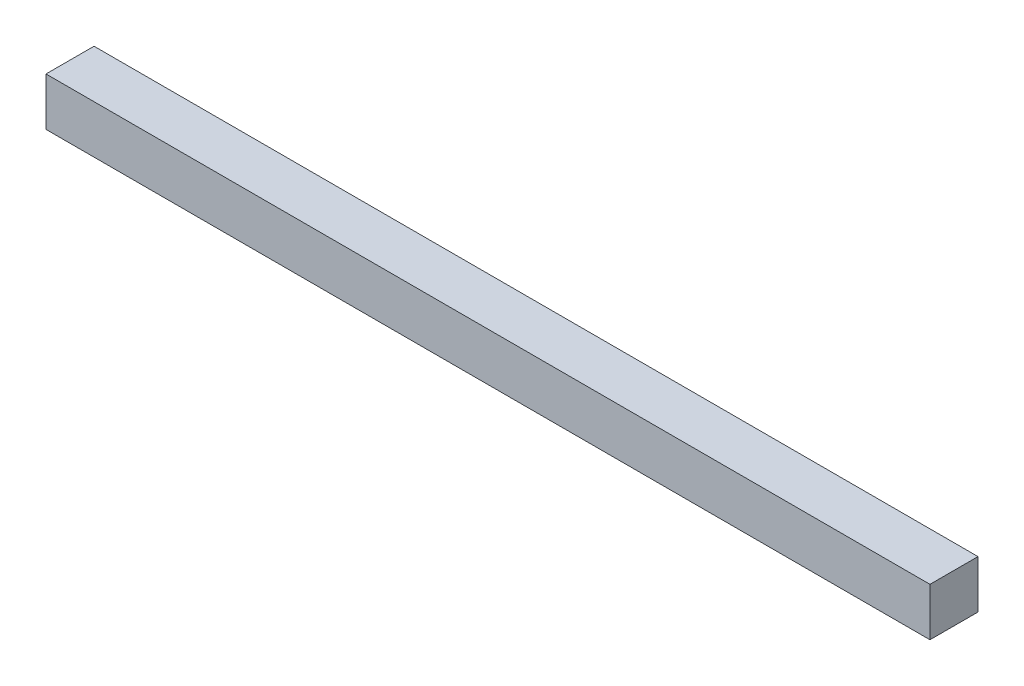
ISO-10303-21;
HEADER;
FILE_DESCRIPTION(('STEP AP214'),'2;1');
FILE_NAME('part.step','',(''),(''),'','','');
FILE_SCHEMA(('AUTOMOTIVE_DESIGN { 1 0 10303 214 1 1 1 1 }'));
ENDSEC;
DATA;
#1=APPLICATION_CONTEXT('core data for automotive mechanical design processes');
#2=APPLICATION_PROTOCOL_DEFINITION('international standard','automotive_design',2000,#1);
#3=PRODUCT_CONTEXT('',#1,'mechanical');
#4=PRODUCT('Part','Part','',(#3));
#5=PRODUCT_RELATED_PRODUCT_CATEGORY('part','',(#4));
#6=PRODUCT_DEFINITION_FORMATION('','',#4);
#7=PRODUCT_DEFINITION_CONTEXT('part definition',#1,'design');
#8=PRODUCT_DEFINITION('design','',#6,#7);
#9=PRODUCT_DEFINITION_SHAPE('','',#8);
#10=(LENGTH_UNIT() NAMED_UNIT(*) SI_UNIT(.MILLI.,.METRE.));
#11=(NAMED_UNIT(*) PLANE_ANGLE_UNIT() SI_UNIT($,.RADIAN.));
#12=(NAMED_UNIT(*) SI_UNIT($,.STERADIAN.) SOLID_ANGLE_UNIT());
#13=UNCERTAINTY_MEASURE_WITH_UNIT(LENGTH_MEASURE(1.E-05),#10,'distance_accuracy_value','');
#14=(GEOMETRIC_REPRESENTATION_CONTEXT(3) GLOBAL_UNCERTAINTY_ASSIGNED_CONTEXT((#13)) GLOBAL_UNIT_ASSIGNED_CONTEXT((#10,
#11,#12)) REPRESENTATION_CONTEXT('',''));
#15=CARTESIAN_POINT('',(0.,0.,0.));
#16=DIRECTION('',(0.,0.,1.));
#17=DIRECTION('',(1.,0.,0.));
#18=AXIS2_PLACEMENT_3D('',#15,#16,#17);
#19=CARTESIAN_POINT('',(0.,-15.875,-15.875));
#20=DIRECTION('',(0.,0.,-1.));
#21=DIRECTION('',(-1.,0.,0.));
#22=AXIS2_PLACEMENT_3D('',#19,#20,#21);
#23=PLANE('',#22);
#24=DIRECTION('',(0.,1.,0.));
#25=VECTOR('',#24,1.);
#26=CARTESIAN_POINT('',(584.2,0.,-15.875));
#27=LINE('',#26,#25);
#28=CARTESIAN_POINT('',(584.2,-15.875,-15.875));
#29=VERTEX_POINT('',#28);
#30=CARTESIAN_POINT('',(584.2,15.875,-15.875));
#31=VERTEX_POINT('',#30);
#32=EDGE_CURVE('E84',#29,#31,#27,.T.);
#33=ORIENTED_EDGE('',*,*,#32,.F.);
#34=DIRECTION('',(1.,0.,0.));
#35=VECTOR('',#34,1.);
#36=CARTESIAN_POINT('',(0.,-15.875,-15.875));
#37=LINE('',#36,#35);
#38=CARTESIAN_POINT('',(0.,-15.875,-15.875));
#39=VERTEX_POINT('',#38);
#40=EDGE_CURVE('E71',#39,#29,#37,.T.);
#41=ORIENTED_EDGE('',*,*,#40,.F.);
#42=DIRECTION('',(0.,1.,0.));
#43=VECTOR('',#42,1.);
#44=CARTESIAN_POINT('',(0.,0.,-15.875));
#45=LINE('',#44,#43);
#46=CARTESIAN_POINT('',(0.,15.875,-15.875));
#47=VERTEX_POINT('',#46);
#48=EDGE_CURVE('E36',#39,#47,#45,.T.);
#49=ORIENTED_EDGE('',*,*,#48,.T.);
#50=DIRECTION('',(1.,0.,0.));
#51=VECTOR('',#50,1.);
#52=CARTESIAN_POINT('',(0.,15.875,-15.875));
#53=LINE('',#52,#51);
#54=EDGE_CURVE('E97',#31,#47,#53,.F.);
#55=ORIENTED_EDGE('',*,*,#54,.F.);
#56=EDGE_LOOP('',(#33,#41,#49,#55));
#57=FACE_BOUND('',#56,.T.);
#58=ADVANCED_FACE('F33',(#57),#23,.T.);
#59=CARTESIAN_POINT('',(0.,0.,0.));
#60=DIRECTION('',(1.,0.,0.));
#61=DIRECTION('',(0.,0.,-1.));
#62=AXIS2_PLACEMENT_3D('',#59,#60,#61);
#63=PLANE('',#62);
#64=DIRECTION('',(0.,0.,1.));
#65=VECTOR('',#64,1.);
#66=CARTESIAN_POINT('',(0.,15.875,-15.875));
#67=LINE('',#66,#65);
#68=CARTESIAN_POINT('',(0.,15.875,15.875));
#69=VERTEX_POINT('',#68);
#70=EDGE_CURVE('E80',#47,#69,#67,.T.);
#71=ORIENTED_EDGE('',*,*,#70,.F.);
#72=ORIENTED_EDGE('',*,*,#48,.F.);
#73=DIRECTION('',(0.,0.,-1.));
#74=VECTOR('',#73,1.);
#75=CARTESIAN_POINT('',(0.,-15.875,15.875));
#76=LINE('',#75,#74);
#77=CARTESIAN_POINT('',(0.,-15.875,15.875));
#78=VERTEX_POINT('',#77);
#79=EDGE_CURVE('E77',#78,#39,#76,.T.);
#80=ORIENTED_EDGE('',*,*,#79,.F.);
#81=DIRECTION('',(0.,1.,0.));
#82=VECTOR('',#81,1.);
#83=CARTESIAN_POINT('',(0.,15.875,15.875));
#84=LINE('',#83,#82);
#85=EDGE_CURVE('E99',#69,#78,#84,.F.);
#86=ORIENTED_EDGE('',*,*,#85,.F.);
#87=EDGE_LOOP('',(#71,#72,#80,#86));
#88=FACE_BOUND('',#87,.T.);
#89=ADVANCED_FACE('F76',(#88),#63,.F.);
#90=CARTESIAN_POINT('',(0.,-15.875,15.875));
#91=DIRECTION('',(0.,-1.,0.));
#92=DIRECTION('',(0.,0.,-1.));
#93=AXIS2_PLACEMENT_3D('',#90,#91,#92);
#94=PLANE('',#93);
#95=DIRECTION('',(0.,0.,-1.));
#96=VECTOR('',#95,1.);
#97=CARTESIAN_POINT('',(584.2,-15.875,0.));
#98=LINE('',#97,#96);
#99=CARTESIAN_POINT('',(584.2,-15.875,15.875));
#100=VERTEX_POINT('',#99);
#101=EDGE_CURVE('E86',#100,#29,#98,.T.);
#102=ORIENTED_EDGE('',*,*,#101,.F.);
#103=DIRECTION('',(1.,0.,0.));
#104=VECTOR('',#103,1.);
#105=CARTESIAN_POINT('',(0.,-15.875,15.875));
#106=LINE('',#105,#104);
#107=EDGE_CURVE('E90',#78,#100,#106,.T.);
#108=ORIENTED_EDGE('',*,*,#107,.F.);
#109=ORIENTED_EDGE('',*,*,#79,.T.);
#110=ORIENTED_EDGE('',*,*,#40,.T.);
#111=EDGE_LOOP('',(#102,#108,#109,#110));
#112=FACE_BOUND('',#111,.T.);
#113=ADVANCED_FACE('F88',(#112),#94,.T.);
#114=CARTESIAN_POINT('',(584.2,0.,0.));
#115=DIRECTION('',(1.,0.,0.));
#116=DIRECTION('',(0.,0.,-1.));
#117=AXIS2_PLACEMENT_3D('',#114,#115,#116);
#118=PLANE('',#117);
#119=ORIENTED_EDGE('',*,*,#32,.T.);
#120=DIRECTION('',(0.,0.,1.));
#121=VECTOR('',#120,1.);
#122=CARTESIAN_POINT('',(584.2,15.875,-15.875));
#123=LINE('',#122,#121);
#124=CARTESIAN_POINT('',(584.2,15.875,15.875));
#125=VERTEX_POINT('',#124);
#126=EDGE_CURVE('E51',#125,#31,#123,.F.);
#127=ORIENTED_EDGE('',*,*,#126,.F.);
#128=DIRECTION('',(0.,1.,0.));
#129=VECTOR('',#128,1.);
#130=CARTESIAN_POINT('',(584.2,15.875,15.875));
#131=LINE('',#130,#129);
#132=EDGE_CURVE('E42',#100,#125,#131,.T.);
#133=ORIENTED_EDGE('',*,*,#132,.F.);
#134=ORIENTED_EDGE('',*,*,#101,.T.);
#135=EDGE_LOOP('',(#119,#127,#133,#134));
#136=FACE_BOUND('',#135,.T.);
#137=ADVANCED_FACE('F105',(#136),#118,.T.);
#138=CARTESIAN_POINT('',(0.,15.875,-15.875));
#139=DIRECTION('',(0.,1.,0.));
#140=DIRECTION('',(0.,0.,1.));
#141=AXIS2_PLACEMENT_3D('',#138,#139,#140);
#142=PLANE('',#141);
#143=ORIENTED_EDGE('',*,*,#126,.T.);
#144=ORIENTED_EDGE('',*,*,#54,.T.);
#145=ORIENTED_EDGE('',*,*,#70,.T.);
#146=DIRECTION('',(1.,0.,0.));
#147=VECTOR('',#146,1.);
#148=CARTESIAN_POINT('',(0.,15.875,15.875));
#149=LINE('',#148,#147);
#150=EDGE_CURVE('E11',#125,#69,#149,.F.);
#151=ORIENTED_EDGE('',*,*,#150,.F.);
#152=EDGE_LOOP('',(#143,#144,#145,#151));
#153=FACE_BOUND('',#152,.T.);
#154=ADVANCED_FACE('F107',(#153),#142,.T.);
#155=CARTESIAN_POINT('',(0.,15.875,15.875));
#156=DIRECTION('',(0.,0.,1.));
#157=DIRECTION('',(1.,0.,0.));
#158=AXIS2_PLACEMENT_3D('',#155,#156,#157);
#159=PLANE('',#158);
#160=ORIENTED_EDGE('',*,*,#132,.T.);
#161=ORIENTED_EDGE('',*,*,#150,.T.);
#162=ORIENTED_EDGE('',*,*,#85,.T.);
#163=ORIENTED_EDGE('',*,*,#107,.T.);
#164=EDGE_LOOP('',(#160,#161,#162,#163));
#165=FACE_BOUND('',#164,.T.);
#166=ADVANCED_FACE('F104',(#165),#159,.T.);
#167=CLOSED_SHELL('',(#58,#89,#113,#137,#154,#166));
#168=MANIFOLD_SOLID_BREP('B2',#167);
#169=ADVANCED_BREP_SHAPE_REPRESENTATION('',(#18,#168),#14);
#170=SHAPE_DEFINITION_REPRESENTATION(#9,#169);
ENDSEC;
END-ISO-10303-21;
